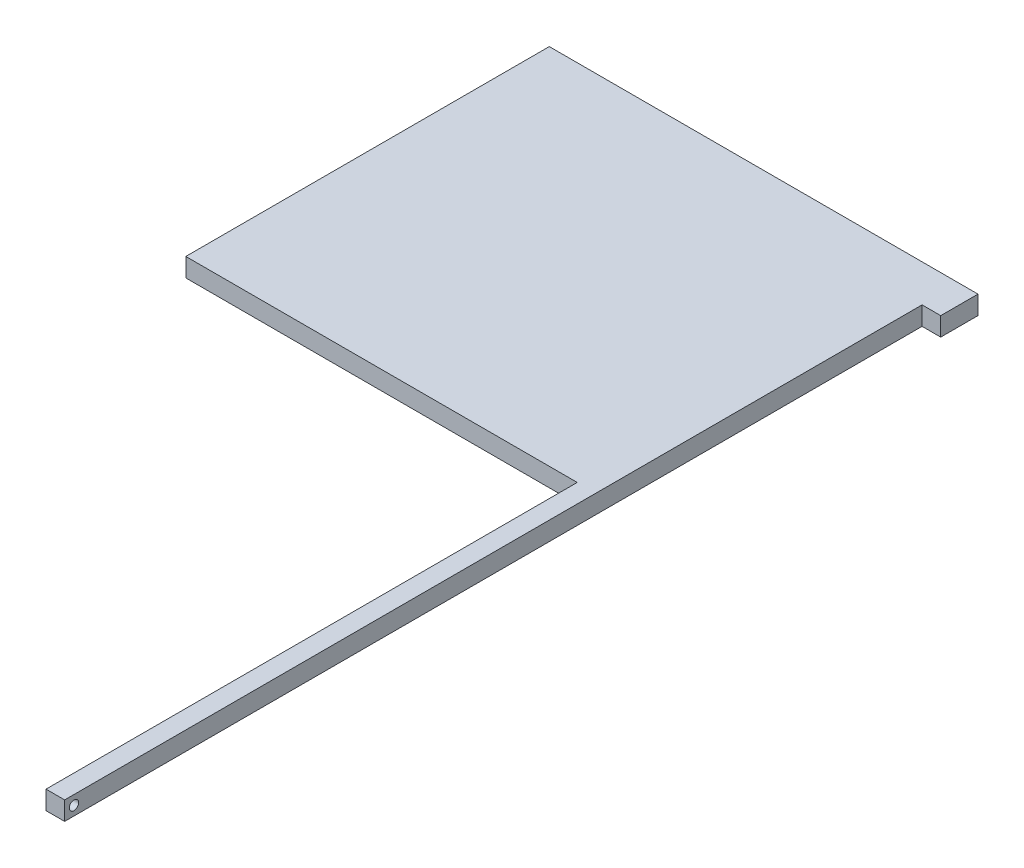
ISO-10303-21;
HEADER;
FILE_DESCRIPTION(('STEP AP214'),'2;1');
FILE_NAME('part.step','',(''),(''),'','','');
FILE_SCHEMA(('AUTOMOTIVE_DESIGN { 1 0 10303 214 1 1 1 1 }'));
ENDSEC;
DATA;
#1=APPLICATION_CONTEXT('core data for automotive mechanical design processes');
#2=APPLICATION_PROTOCOL_DEFINITION('international standard','automotive_design',2000,#1);
#3=PRODUCT_CONTEXT('',#1,'mechanical');
#4=PRODUCT('Part','Part','',(#3));
#5=PRODUCT_RELATED_PRODUCT_CATEGORY('part','',(#4));
#6=PRODUCT_DEFINITION_FORMATION('','',#4);
#7=PRODUCT_DEFINITION_CONTEXT('part definition',#1,'design');
#8=PRODUCT_DEFINITION('design','',#6,#7);
#9=PRODUCT_DEFINITION_SHAPE('','',#8);
#10=(LENGTH_UNIT() NAMED_UNIT(*) SI_UNIT(.MILLI.,.METRE.));
#11=(NAMED_UNIT(*) PLANE_ANGLE_UNIT() SI_UNIT($,.RADIAN.));
#12=(NAMED_UNIT(*) SI_UNIT($,.STERADIAN.) SOLID_ANGLE_UNIT());
#13=UNCERTAINTY_MEASURE_WITH_UNIT(LENGTH_MEASURE(1.E-05),#10,'distance_accuracy_value','');
#14=(GEOMETRIC_REPRESENTATION_CONTEXT(3) GLOBAL_UNCERTAINTY_ASSIGNED_CONTEXT((#13)) GLOBAL_UNIT_ASSIGNED_CONTEXT((#10,
#11,#12)) REPRESENTATION_CONTEXT('',''));
#15=CARTESIAN_POINT('',(0.,0.,0.));
#16=DIRECTION('',(0.,0.,1.));
#17=DIRECTION('',(1.,0.,0.));
#18=AXIS2_PLACEMENT_3D('',#15,#16,#17);
#19=CARTESIAN_POINT('',(241.3,12.7,-152.4));
#20=DIRECTION('',(-1.,0.,0.));
#21=DIRECTION('',(0.,0.,1.));
#22=AXIS2_PLACEMENT_3D('',#19,#20,#21);
#23=PLANE('',#22);
#24=CARTESIAN_POINT('',(241.3,15.875,149.225));
#25=DIRECTION('',(-1.,0.,0.));
#26=DIRECTION('',(0.,0.,1.));
#27=AXIS2_PLACEMENT_3D('',#24,#25,#26);
#28=CIRCLE('',#27,1.58749999999999);
#29=CARTESIAN_POINT('',(241.3,15.875,150.8125));
#30=VERTEX_POINT('',#29);
#31=EDGE_CURVE('E159',#30,#30,#28,.T.);
#32=ORIENTED_EDGE('',*,*,#31,.T.);
#33=EDGE_LOOP('',(#32));
#34=FACE_BOUND('',#33,.T.);
#35=DIRECTION('',(0.,0.,1.));
#36=VECTOR('',#35,1.);
#37=CARTESIAN_POINT('',(241.3,12.7,-139.7));
#38=LINE('',#37,#36);
#39=CARTESIAN_POINT('',(241.3,12.7,-139.7));
#40=VERTEX_POINT('',#39);
#41=CARTESIAN_POINT('',(241.3,12.7,152.4));
#42=VERTEX_POINT('',#41);
#43=EDGE_CURVE('E164',#40,#42,#38,.T.);
#44=ORIENTED_EDGE('',*,*,#43,.F.);
#45=DIRECTION('',(0.,1.,0.));
#46=VECTOR('',#45,1.);
#47=CARTESIAN_POINT('',(241.3,19.05,-139.7));
#48=LINE('',#47,#46);
#49=CARTESIAN_POINT('',(241.3,19.05,-139.7));
#50=VERTEX_POINT('',#49);
#51=EDGE_CURVE('E65',#40,#50,#48,.T.);
#52=ORIENTED_EDGE('',*,*,#51,.T.);
#53=DIRECTION('',(0.,0.,-1.));
#54=VECTOR('',#53,1.);
#55=CARTESIAN_POINT('',(241.3,19.05,-152.4));
#56=LINE('',#55,#54);
#57=CARTESIAN_POINT('',(241.3,19.05,152.4));
#58=VERTEX_POINT('',#57);
#59=EDGE_CURVE('E132',#58,#50,#56,.T.);
#60=ORIENTED_EDGE('',*,*,#59,.F.);
#61=DIRECTION('',(0.,-1.,0.));
#62=VECTOR('',#61,1.);
#63=CARTESIAN_POINT('',(241.3,12.7,152.4));
#64=LINE('',#63,#62);
#65=EDGE_CURVE('E51',#58,#42,#64,.T.);
#66=ORIENTED_EDGE('',*,*,#65,.T.);
#67=EDGE_LOOP('',(#44,#52,#60,#66));
#68=FACE_BOUND('',#67,.T.);
#69=ADVANCED_FACE('F43',(#34,#68),#23,.F.);
#70=CARTESIAN_POINT('',(-241.3,12.7,-152.4));
#71=DIRECTION('',(0.,0.,1.));
#72=DIRECTION('',(1.,0.,0.));
#73=AXIS2_PLACEMENT_3D('',#70,#71,#72);
#74=PLANE('',#73);
#75=DIRECTION('',(-1.,0.,0.));
#76=VECTOR('',#75,1.);
#77=CARTESIAN_POINT('',(247.650012,12.7,-152.4));
#78=LINE('',#77,#76);
#79=CARTESIAN_POINT('',(247.65,12.7,-152.4));
#80=VERTEX_POINT('',#79);
#81=CARTESIAN_POINT('',(101.6,12.7,-152.4));
#82=VERTEX_POINT('',#81);
#83=EDGE_CURVE('E122',#80,#82,#78,.T.);
#84=ORIENTED_EDGE('',*,*,#83,.T.);
#85=DIRECTION('',(0.,1.,0.));
#86=VECTOR('',#85,1.);
#87=CARTESIAN_POINT('',(101.6,12.7,-152.4));
#88=LINE('',#87,#86);
#89=CARTESIAN_POINT('',(101.6,19.05,-152.4));
#90=VERTEX_POINT('',#89);
#91=EDGE_CURVE('E58',#82,#90,#88,.T.);
#92=ORIENTED_EDGE('',*,*,#91,.T.);
#93=DIRECTION('',(-1.,0.,0.));
#94=VECTOR('',#93,1.);
#95=CARTESIAN_POINT('',(241.3,19.05,-152.4));
#96=LINE('',#95,#94);
#97=CARTESIAN_POINT('',(247.65,19.05,-152.4));
#98=VERTEX_POINT('',#97);
#99=EDGE_CURVE('E120',#98,#90,#96,.T.);
#100=ORIENTED_EDGE('',*,*,#99,.F.);
#101=DIRECTION('',(0.,-1.,0.));
#102=VECTOR('',#101,1.);
#103=CARTESIAN_POINT('',(247.65,19.05,-152.4));
#104=LINE('',#103,#102);
#105=EDGE_CURVE('E203',#98,#80,#104,.T.);
#106=ORIENTED_EDGE('',*,*,#105,.T.);
#107=EDGE_LOOP('',(#84,#92,#100,#106));
#108=FACE_BOUND('',#107,.T.);
#109=ADVANCED_FACE('F118',(#108),#74,.F.);
#110=CARTESIAN_POINT('',(-241.3,12.7,152.4));
#111=DIRECTION('',(0.,0.,-1.));
#112=DIRECTION('',(-1.,0.,0.));
#113=AXIS2_PLACEMENT_3D('',#110,#111,#112);
#114=PLANE('',#113);
#115=DIRECTION('',(0.,-1.,0.));
#116=VECTOR('',#115,1.);
#117=CARTESIAN_POINT('',(234.95,19.05,152.4));
#118=LINE('',#117,#116);
#119=CARTESIAN_POINT('',(234.95,19.05,152.4));
#120=VERTEX_POINT('',#119);
#121=CARTESIAN_POINT('',(234.95,12.7,152.4));
#122=VERTEX_POINT('',#121);
#123=EDGE_CURVE('E131',#120,#122,#118,.T.);
#124=ORIENTED_EDGE('',*,*,#123,.T.);
#125=DIRECTION('',(-1.,0.,0.));
#126=VECTOR('',#125,1.);
#127=CARTESIAN_POINT('',(247.650012,12.7,152.4));
#128=LINE('',#127,#126);
#129=EDGE_CURVE('E186',#42,#122,#128,.T.);
#130=ORIENTED_EDGE('',*,*,#129,.F.);
#131=ORIENTED_EDGE('',*,*,#65,.F.);
#132=DIRECTION('',(1.,0.,0.));
#133=VECTOR('',#132,1.);
#134=CARTESIAN_POINT('',(241.3,19.05,152.4));
#135=LINE('',#134,#133);
#136=EDGE_CURVE('E139',#120,#58,#135,.T.);
#137=ORIENTED_EDGE('',*,*,#136,.F.);
#138=EDGE_LOOP('',(#124,#130,#131,#137));
#139=FACE_BOUND('',#138,.T.);
#140=ADVANCED_FACE('F185',(#139),#114,.F.);
#141=CARTESIAN_POINT('',(-234.95,19.05,-28.575));
#142=DIRECTION('',(0.,0.,-1.));
#143=DIRECTION('',(-1.,0.,0.));
#144=AXIS2_PLACEMENT_3D('',#141,#142,#143);
#145=PLANE('',#144);
#146=DIRECTION('',(1.,0.,0.));
#147=VECTOR('',#146,1.);
#148=CARTESIAN_POINT('',(-234.95,19.05,-28.575));
#149=LINE('',#148,#147);
#150=CARTESIAN_POINT('',(101.6,19.05,-28.575));
#151=VERTEX_POINT('',#150);
#152=CARTESIAN_POINT('',(234.95,19.05,-28.575));
#153=VERTEX_POINT('',#152);
#154=EDGE_CURVE('E150',#151,#153,#149,.T.);
#155=ORIENTED_EDGE('',*,*,#154,.F.);
#156=DIRECTION('',(0.,-1.,0.));
#157=VECTOR('',#156,1.);
#158=CARTESIAN_POINT('',(101.6,19.05,-28.575));
#159=LINE('',#158,#157);
#160=CARTESIAN_POINT('',(101.6,12.7,-28.575));
#161=VERTEX_POINT('',#160);
#162=EDGE_CURVE('E110',#151,#161,#159,.T.);
#163=ORIENTED_EDGE('',*,*,#162,.T.);
#164=DIRECTION('',(1.,0.,0.));
#165=VECTOR('',#164,1.);
#166=CARTESIAN_POINT('',(-234.95,12.7,-28.575));
#167=LINE('',#166,#165);
#168=CARTESIAN_POINT('',(234.95,12.7,-28.575));
#169=VERTEX_POINT('',#168);
#170=EDGE_CURVE('E143',#161,#169,#167,.T.);
#171=ORIENTED_EDGE('',*,*,#170,.T.);
#172=DIRECTION('',(0.,-1.,0.));
#173=VECTOR('',#172,1.);
#174=CARTESIAN_POINT('',(234.95,19.05,-28.575));
#175=LINE('',#174,#173);
#176=EDGE_CURVE('E137',#153,#169,#175,.T.);
#177=ORIENTED_EDGE('',*,*,#176,.F.);
#178=EDGE_LOOP('',(#155,#163,#171,#177));
#179=FACE_BOUND('',#178,.T.);
#180=ADVANCED_FACE('F222',(#179),#145,.F.);
#181=CARTESIAN_POINT('',(234.95,19.05,-28.575));
#182=DIRECTION('',(1.,0.,0.));
#183=DIRECTION('',(0.,0.,-1.));
#184=AXIS2_PLACEMENT_3D('',#181,#182,#183);
#185=PLANE('',#184);
#186=CARTESIAN_POINT('',(234.95,15.875,149.225));
#187=DIRECTION('',(1.,0.,0.));
#188=DIRECTION('',(0.,0.,-1.));
#189=AXIS2_PLACEMENT_3D('',#186,#187,#188);
#190=CIRCLE('',#189,1.58749999999999);
#191=CARTESIAN_POINT('',(234.95,15.875,147.6375));
#192=VERTEX_POINT('',#191);
#193=EDGE_CURVE('E147',#192,#192,#190,.T.);
#194=ORIENTED_EDGE('',*,*,#193,.T.);
#195=EDGE_LOOP('',(#194));
#196=FACE_BOUND('',#195,.T.);
#197=DIRECTION('',(0.,0.,1.));
#198=VECTOR('',#197,1.);
#199=CARTESIAN_POINT('',(234.95,12.7,-28.575));
#200=LINE('',#199,#198);
#201=EDGE_CURVE('E146',#169,#122,#200,.T.);
#202=ORIENTED_EDGE('',*,*,#201,.T.);
#203=ORIENTED_EDGE('',*,*,#123,.F.);
#204=DIRECTION('',(0.,0.,1.));
#205=VECTOR('',#204,1.);
#206=CARTESIAN_POINT('',(234.95,19.05,-28.575));
#207=LINE('',#206,#205);
#208=EDGE_CURVE('E175',#153,#120,#207,.T.);
#209=ORIENTED_EDGE('',*,*,#208,.F.);
#210=ORIENTED_EDGE('',*,*,#176,.T.);
#211=EDGE_LOOP('',(#202,#203,#209,#210));
#212=FACE_BOUND('',#211,.T.);
#213=ADVANCED_FACE('F225',(#196,#212),#185,.F.);
#214=CARTESIAN_POINT('',(0.,19.05,0.));
#215=DIRECTION('',(0.,1.,0.));
#216=DIRECTION('',(0.,0.,1.));
#217=AXIS2_PLACEMENT_3D('',#214,#215,#216);
#218=PLANE('',#217);
#219=DIRECTION('',(0.,0.,-1.));
#220=VECTOR('',#219,1.);
#221=CARTESIAN_POINT('',(101.6,19.05,-152.4));
#222=LINE('',#221,#220);
#223=EDGE_CURVE('E107',#151,#90,#222,.T.);
#224=ORIENTED_EDGE('',*,*,#223,.F.);
#225=ORIENTED_EDGE('',*,*,#154,.T.);
#226=ORIENTED_EDGE('',*,*,#208,.T.);
#227=ORIENTED_EDGE('',*,*,#136,.T.);
#228=ORIENTED_EDGE('',*,*,#59,.T.);
#229=DIRECTION('',(-1.,0.,0.));
#230=VECTOR('',#229,1.);
#231=CARTESIAN_POINT('',(753.145250599196,19.05,-139.7));
#232=LINE('',#231,#230);
#233=CARTESIAN_POINT('',(247.65,19.05,-139.7));
#234=VERTEX_POINT('',#233);
#235=EDGE_CURVE('E208',#234,#50,#232,.T.);
#236=ORIENTED_EDGE('',*,*,#235,.F.);
#237=DIRECTION('',(0.,0.,-1.));
#238=VECTOR('',#237,1.);
#239=CARTESIAN_POINT('',(247.65,19.05,-152.4));
#240=LINE('',#239,#238);
#241=EDGE_CURVE('E129',#234,#98,#240,.T.);
#242=ORIENTED_EDGE('',*,*,#241,.T.);
#243=ORIENTED_EDGE('',*,*,#99,.T.);
#244=EDGE_LOOP('',(#224,#225,#226,#227,#228,#236,#242,#243));
#245=FACE_BOUND('',#244,.T.);
#246=ADVANCED_FACE('F126',(#245),#218,.T.);
#247=CARTESIAN_POINT('',(241.3,15.875,149.225));
#248=DIRECTION('',(-1.,0.,0.));
#249=DIRECTION('',(0.,0.,1.));
#250=AXIS2_PLACEMENT_3D('',#247,#248,#249);
#251=CYLINDRICAL_SURFACE('',#250,1.58749999999999);
#252=ORIENTED_EDGE('',*,*,#31,.F.);
#253=EDGE_LOOP('',(#252));
#254=FACE_BOUND('',#253,.T.);
#255=ORIENTED_EDGE('',*,*,#193,.F.);
#256=EDGE_LOOP('',(#255));
#257=FACE_BOUND('',#256,.T.);
#258=ADVANCED_FACE('F232',(#254,#257),#251,.F.);
#259=CARTESIAN_POINT('',(247.65,12.7,-139.7));
#260=DIRECTION('',(-1.,0.,0.));
#261=DIRECTION('',(0.,0.,1.));
#262=AXIS2_PLACEMENT_3D('',#259,#260,#261);
#263=PLANE('',#262);
#264=DIRECTION('',(0.,1.,0.));
#265=VECTOR('',#264,1.);
#266=CARTESIAN_POINT('',(247.65,19.05,-139.7));
#267=LINE('',#266,#265);
#268=CARTESIAN_POINT('',(247.65,12.7,-139.7));
#269=VERTEX_POINT('',#268);
#270=EDGE_CURVE('E202',#269,#234,#267,.T.);
#271=ORIENTED_EDGE('',*,*,#270,.F.);
#272=DIRECTION('',(0.,0.,-1.));
#273=VECTOR('',#272,1.);
#274=CARTESIAN_POINT('',(247.65,12.7,-139.7));
#275=LINE('',#274,#273);
#276=EDGE_CURVE('E193',#269,#80,#275,.T.);
#277=ORIENTED_EDGE('',*,*,#276,.T.);
#278=ORIENTED_EDGE('',*,*,#105,.F.);
#279=ORIENTED_EDGE('',*,*,#241,.F.);
#280=EDGE_LOOP('',(#271,#277,#278,#279));
#281=FACE_BOUND('',#280,.T.);
#282=ADVANCED_FACE('F218',(#281),#263,.F.);
#283=CARTESIAN_POINT('',(753.145250599196,19.05,-139.7));
#284=DIRECTION('',(0.,0.,1.));
#285=DIRECTION('',(1.,0.,0.));
#286=AXIS2_PLACEMENT_3D('',#283,#284,#285);
#287=PLANE('',#286);
#288=DIRECTION('',(1.,0.,0.));
#289=VECTOR('',#288,1.);
#290=CARTESIAN_POINT('',(241.3,12.7,-139.7));
#291=LINE('',#290,#289);
#292=EDGE_CURVE('E169',#40,#269,#291,.T.);
#293=ORIENTED_EDGE('',*,*,#292,.T.);
#294=ORIENTED_EDGE('',*,*,#270,.T.);
#295=ORIENTED_EDGE('',*,*,#235,.T.);
#296=ORIENTED_EDGE('',*,*,#51,.F.);
#297=EDGE_LOOP('',(#293,#294,#295,#296));
#298=FACE_BOUND('',#297,.T.);
#299=ADVANCED_FACE('F216',(#298),#287,.T.);
#300=CARTESIAN_POINT('',(247.650012,12.7,152.4));
#301=DIRECTION('',(0.,1.,0.));
#302=DIRECTION('',(0.,0.,1.));
#303=AXIS2_PLACEMENT_3D('',#300,#301,#302);
#304=PLANE('',#303);
#305=ORIENTED_EDGE('',*,*,#170,.F.);
#306=DIRECTION('',(0.,0.,-1.));
#307=VECTOR('',#306,1.);
#308=CARTESIAN_POINT('',(101.6,12.7,152.4));
#309=LINE('',#308,#307);
#310=EDGE_CURVE('E11',#161,#82,#309,.T.);
#311=ORIENTED_EDGE('',*,*,#310,.T.);
#312=ORIENTED_EDGE('',*,*,#83,.F.);
#313=ORIENTED_EDGE('',*,*,#276,.F.);
#314=ORIENTED_EDGE('',*,*,#292,.F.);
#315=ORIENTED_EDGE('',*,*,#43,.T.);
#316=ORIENTED_EDGE('',*,*,#129,.T.);
#317=ORIENTED_EDGE('',*,*,#201,.F.);
#318=EDGE_LOOP('',(#305,#311,#312,#313,#314,#315,#316,#317));
#319=FACE_BOUND('',#318,.T.);
#320=ADVANCED_FACE('F220',(#319),#304,.F.);
#321=CARTESIAN_POINT('',(101.6,12.7,-152.4));
#322=DIRECTION('',(1.,0.,0.));
#323=DIRECTION('',(0.,0.,-1.));
#324=AXIS2_PLACEMENT_3D('',#321,#322,#323);
#325=PLANE('',#324);
#326=ORIENTED_EDGE('',*,*,#223,.T.);
#327=ORIENTED_EDGE('',*,*,#91,.F.);
#328=ORIENTED_EDGE('',*,*,#310,.F.);
#329=ORIENTED_EDGE('',*,*,#162,.F.);
#330=EDGE_LOOP('',(#326,#327,#328,#329));
#331=FACE_BOUND('',#330,.T.);
#332=ADVANCED_FACE('F108',(#331),#325,.F.);
#333=CLOSED_SHELL('',(#69,#109,#140,#180,#213,#246,#258,#282,#299,#320,#332));
#334=MANIFOLD_SOLID_BREP('B2',#333);
#335=ADVANCED_BREP_SHAPE_REPRESENTATION('',(#18,#334),#14);
#336=SHAPE_DEFINITION_REPRESENTATION(#9,#335);
ENDSEC;
END-ISO-10303-21;
